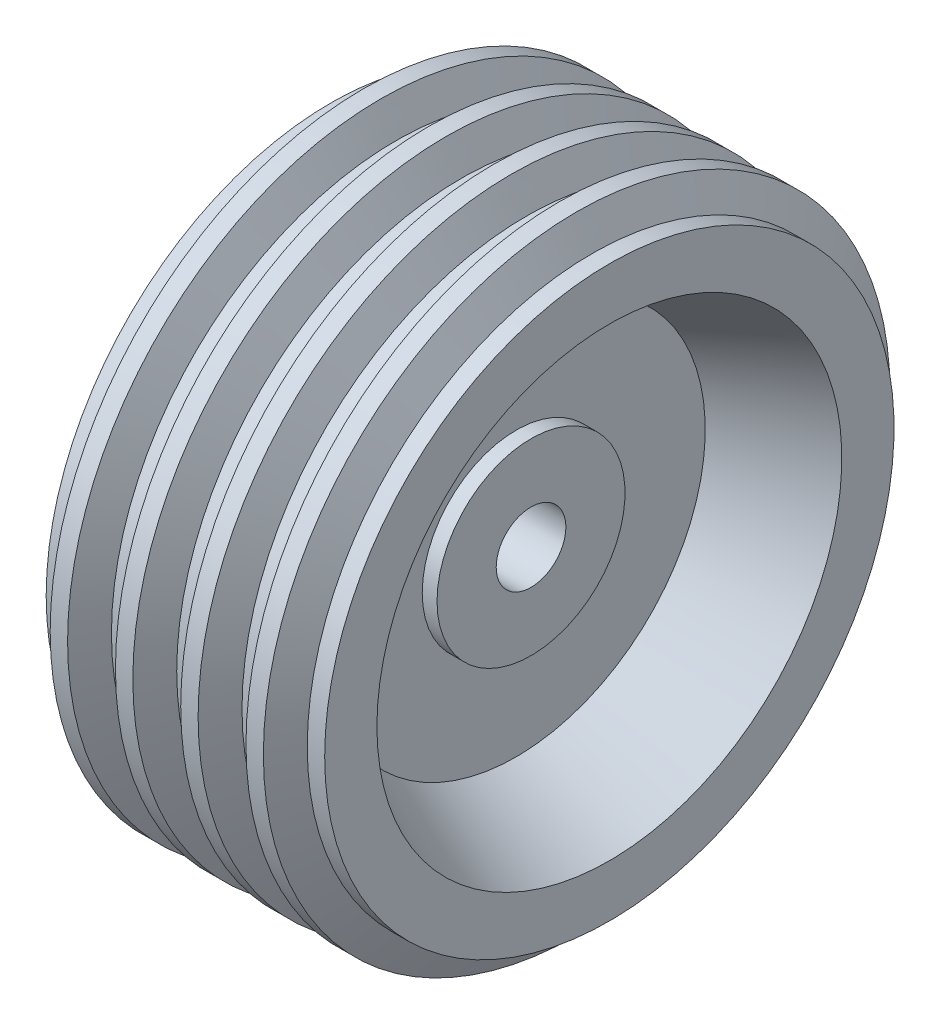
ISO-10303-21;
HEADER;
FILE_DESCRIPTION(('STEP AP214'),'2;1');
FILE_NAME('part.step','',(''),(''),'','','');
FILE_SCHEMA(('AUTOMOTIVE_DESIGN { 1 0 10303 214 1 1 1 1 }'));
ENDSEC;
DATA;
#1=APPLICATION_CONTEXT('core data for automotive mechanical design processes');
#2=APPLICATION_PROTOCOL_DEFINITION('international standard','automotive_design',2000,#1);
#3=PRODUCT_CONTEXT('',#1,'mechanical');
#4=PRODUCT('Part','Part','',(#3));
#5=PRODUCT_RELATED_PRODUCT_CATEGORY('part','',(#4));
#6=PRODUCT_DEFINITION_FORMATION('','',#4);
#7=PRODUCT_DEFINITION_CONTEXT('part definition',#1,'design');
#8=PRODUCT_DEFINITION('design','',#6,#7);
#9=PRODUCT_DEFINITION_SHAPE('','',#8);
#10=(LENGTH_UNIT() NAMED_UNIT(*) SI_UNIT(.MILLI.,.METRE.));
#11=(NAMED_UNIT(*) PLANE_ANGLE_UNIT() SI_UNIT($,.RADIAN.));
#12=(NAMED_UNIT(*) SI_UNIT($,.STERADIAN.) SOLID_ANGLE_UNIT());
#13=UNCERTAINTY_MEASURE_WITH_UNIT(LENGTH_MEASURE(1.E-05),#10,'distance_accuracy_value','');
#14=(GEOMETRIC_REPRESENTATION_CONTEXT(3) GLOBAL_UNCERTAINTY_ASSIGNED_CONTEXT((#13)) GLOBAL_UNIT_ASSIGNED_CONTEXT((#10,
#11,#12)) REPRESENTATION_CONTEXT('',''));
#15=CARTESIAN_POINT('',(0.,0.,0.));
#16=DIRECTION('',(0.,0.,1.));
#17=DIRECTION('',(1.,0.,0.));
#18=AXIS2_PLACEMENT_3D('',#15,#16,#17);
#19=CARTESIAN_POINT('',(-35.,0.,0.));
#20=DIRECTION('',(-1.,0.,0.));
#21=DIRECTION('',(0.,0.,1.));
#22=AXIS2_PLACEMENT_3D('',#19,#20,#21);
#23=PLANE('',#22);
#24=CARTESIAN_POINT('',(-35.,0.,0.));
#25=DIRECTION('',(-1.,0.,0.));
#26=DIRECTION('',(0.,0.,1.));
#27=AXIS2_PLACEMENT_3D('',#24,#25,#26);
#28=CIRCLE('',#27,54.);
#29=CARTESIAN_POINT('',(-35.,0.,54.));
#30=VERTEX_POINT('',#29);
#31=EDGE_CURVE('E121',#30,#30,#28,.T.);
#32=ORIENTED_EDGE('',*,*,#31,.T.);
#33=EDGE_LOOP('',(#32));
#34=FACE_BOUND('',#33,.T.);
#35=CARTESIAN_POINT('',(-35.,0.,0.));
#36=DIRECTION('',(-1.,0.,0.));
#37=DIRECTION('',(0.,0.,1.));
#38=AXIS2_PLACEMENT_3D('',#35,#36,#37);
#39=CIRCLE('',#38,20.);
#40=CARTESIAN_POINT('',(-35.,0.,20.));
#41=VERTEX_POINT('',#40);
#42=EDGE_CURVE('E10',#41,#41,#39,.T.);
#43=ORIENTED_EDGE('',*,*,#42,.F.);
#44=EDGE_LOOP('',(#43));
#45=FACE_BOUND('',#44,.T.);
#46=ADVANCED_FACE('F33',(#34,#45),#23,.T.);
#47=CARTESIAN_POINT('',(-35.,0.,0.));
#48=DIRECTION('',(-1.,0.,0.));
#49=DIRECTION('',(0.,0.,1.));
#50=AXIS2_PLACEMENT_3D('',#47,#48,#49);
#51=CYLINDRICAL_SURFACE('',#50,20.);
#52=CARTESIAN_POINT('',(35.,0.,0.));
#53=DIRECTION('',(-1.,0.,0.));
#54=DIRECTION('',(0.,0.,1.));
#55=AXIS2_PLACEMENT_3D('',#52,#53,#54);
#56=CIRCLE('',#55,20.);
#57=CARTESIAN_POINT('',(35.,0.,20.));
#58=VERTEX_POINT('',#57);
#59=EDGE_CURVE('E39',#58,#58,#56,.T.);
#60=ORIENTED_EDGE('',*,*,#59,.F.);
#61=EDGE_LOOP('',(#60));
#62=FACE_BOUND('',#61,.T.);
#63=ORIENTED_EDGE('',*,*,#42,.T.);
#64=EDGE_LOOP('',(#63));
#65=FACE_BOUND('',#64,.T.);
#66=ADVANCED_FACE('F139',(#62,#65),#51,.F.);
#67=CARTESIAN_POINT('',(35.,0.,0.));
#68=DIRECTION('',(-1.,0.,0.));
#69=DIRECTION('',(0.,0.,1.));
#70=AXIS2_PLACEMENT_3D('',#67,#68,#69);
#71=PLANE('',#70);
#72=CARTESIAN_POINT('',(35.,0.,0.));
#73=DIRECTION('',(-1.,0.,0.));
#74=DIRECTION('',(0.,0.,1.));
#75=AXIS2_PLACEMENT_3D('',#72,#73,#74);
#76=CIRCLE('',#75,54.);
#77=CARTESIAN_POINT('',(35.,0.,54.));
#78=VERTEX_POINT('',#77);
#79=EDGE_CURVE('E43',#78,#78,#76,.T.);
#80=ORIENTED_EDGE('',*,*,#79,.F.);
#81=EDGE_LOOP('',(#80));
#82=FACE_BOUND('',#81,.T.);
#83=ORIENTED_EDGE('',*,*,#59,.T.);
#84=EDGE_LOOP('',(#83));
#85=FACE_BOUND('',#84,.T.);
#86=ADVANCED_FACE('F143',(#82,#85),#71,.F.);
#87=CARTESIAN_POINT('',(-35.,0.,0.));
#88=DIRECTION('',(-1.,0.,0.));
#89=DIRECTION('',(0.,0.,1.));
#90=AXIS2_PLACEMENT_3D('',#87,#88,#89);
#91=CYLINDRICAL_SURFACE('',#90,54.);
#92=CARTESIAN_POINT('',(26.5,0.,0.));
#93=DIRECTION('',(-1.,0.,0.));
#94=DIRECTION('',(0.,0.,1.));
#95=AXIS2_PLACEMENT_3D('',#92,#93,#94);
#96=CIRCLE('',#95,54.);
#97=CARTESIAN_POINT('',(26.5,0.,54.));
#98=VERTEX_POINT('',#97);
#99=EDGE_CURVE('E47',#98,#98,#96,.T.);
#100=ORIENTED_EDGE('',*,*,#99,.F.);
#101=EDGE_LOOP('',(#100));
#102=FACE_BOUND('',#101,.T.);
#103=ORIENTED_EDGE('',*,*,#79,.T.);
#104=EDGE_LOOP('',(#103));
#105=FACE_BOUND('',#104,.T.);
#106=ADVANCED_FACE('F148',(#102,#105),#91,.T.);
#107=CARTESIAN_POINT('',(26.5,0.,0.));
#108=DIRECTION('',(-1.,0.,0.));
#109=DIRECTION('',(0.,0.,1.));
#110=AXIS2_PLACEMENT_3D('',#107,#108,#109);
#111=PLANE('',#110);
#112=CARTESIAN_POINT('',(26.5,0.,0.));
#113=DIRECTION('',(-1.,0.,0.));
#114=DIRECTION('',(0.,0.,1.));
#115=AXIS2_PLACEMENT_3D('',#112,#113,#114);
#116=CIRCLE('',#115,108.596183718707);
#117=CARTESIAN_POINT('',(26.5,0.,108.596183718707));
#118=VERTEX_POINT('',#117);
#119=EDGE_CURVE('E52',#118,#118,#116,.T.);
#120=ORIENTED_EDGE('',*,*,#119,.F.);
#121=EDGE_LOOP('',(#120));
#122=FACE_BOUND('',#121,.T.);
#123=ORIENTED_EDGE('',*,*,#99,.T.);
#124=EDGE_LOOP('',(#123));
#125=FACE_BOUND('',#124,.T.);
#126=ADVANCED_FACE('F154',(#122,#125),#111,.F.);
#127=CARTESIAN_POINT('',(80.,0.,0.));
#128=DIRECTION('',(1.,0.,0.));
#129=DIRECTION('',(0.,0.,-1.));
#130=AXIS2_PLACEMENT_3D('',#127,#128,#129);
#131=CONICAL_SURFACE('',#130,133.54364343,0.436332312998587);
#132=ORIENTED_EDGE('',*,*,#119,.T.);
#133=EDGE_LOOP('',(#132));
#134=FACE_BOUND('',#133,.T.);
#135=CARTESIAN_POINT('',(80.,0.,0.));
#136=DIRECTION('',(-1.,0.,0.));
#137=DIRECTION('',(0.,0.,1.));
#138=AXIS2_PLACEMENT_3D('',#135,#136,#137);
#139=CIRCLE('',#138,133.54364343);
#140=CARTESIAN_POINT('',(80.,0.,133.54364343));
#141=VERTEX_POINT('',#140);
#142=EDGE_CURVE('E55',#141,#141,#139,.T.);
#143=ORIENTED_EDGE('',*,*,#142,.F.);
#144=EDGE_LOOP('',(#143));
#145=FACE_BOUND('',#144,.T.);
#146=ADVANCED_FACE('F158',(#134,#145),#131,.F.);
#147=CARTESIAN_POINT('',(80.,0.,0.));
#148=DIRECTION('',(1.,0.,0.));
#149=DIRECTION('',(0.,0.,-1.));
#150=AXIS2_PLACEMENT_3D('',#147,#148,#149);
#151=PLANE('',#150);
#152=ORIENTED_EDGE('',*,*,#142,.T.);
#153=EDGE_LOOP('',(#152));
#154=FACE_BOUND('',#153,.T.);
#155=CARTESIAN_POINT('',(80.,0.,0.));
#156=DIRECTION('',(-1.,0.,0.));
#157=DIRECTION('',(0.,0.,1.));
#158=AXIS2_PLACEMENT_3D('',#155,#156,#157);
#159=CIRCLE('',#158,163.54364343);
#160=CARTESIAN_POINT('',(80.,0.,163.54364343));
#161=VERTEX_POINT('',#160);
#162=EDGE_CURVE('E58',#161,#161,#159,.T.);
#163=ORIENTED_EDGE('',*,*,#162,.F.);
#164=EDGE_LOOP('',(#163));
#165=FACE_BOUND('',#164,.T.);
#166=ADVANCED_FACE('F162',(#154,#165),#151,.T.);
#167=CARTESIAN_POINT('',(-35.,0.,0.));
#168=DIRECTION('',(-1.,0.,0.));
#169=DIRECTION('',(0.,0.,1.));
#170=AXIS2_PLACEMENT_3D('',#167,#168,#169);
#171=CYLINDRICAL_SURFACE('',#170,163.54364343);
#172=ORIENTED_EDGE('',*,*,#162,.T.);
#173=EDGE_LOOP('',(#172));
#174=FACE_BOUND('',#173,.T.);
#175=CARTESIAN_POINT('',(69.9916425424816,0.,0.));
#176=DIRECTION('',(-1.,0.,0.));
#177=DIRECTION('',(0.,0.,1.));
#178=AXIS2_PLACEMENT_3D('',#175,#176,#177);
#179=CIRCLE('',#178,163.54364343);
#180=CARTESIAN_POINT('',(69.9916425424816,0.,163.54364343));
#181=VERTEX_POINT('',#180);
#182=EDGE_CURVE('E61',#181,#181,#179,.T.);
#183=ORIENTED_EDGE('',*,*,#182,.F.);
#184=EDGE_LOOP('',(#183));
#185=FACE_BOUND('',#184,.T.);
#186=ADVANCED_FACE('F166',(#174,#185),#171,.T.);
#187=CARTESIAN_POINT('',(61.2416425434285,0.,0.));
#188=DIRECTION('',(-1.,0.,0.));
#189=DIRECTION('',(0.,0.,1.));
#190=AXIS2_PLACEMENT_3D('',#187,#188,#189);
#191=CONICAL_SURFACE('',#190,180.,1.0821041362365);
#192=ORIENTED_EDGE('',*,*,#182,.T.);
#193=EDGE_LOOP('',(#192));
#194=FACE_BOUND('',#193,.T.);
#195=CARTESIAN_POINT('',(61.2416425434285,0.,0.));
#196=DIRECTION('',(-1.,0.,0.));
#197=DIRECTION('',(0.,0.,1.));
#198=AXIS2_PLACEMENT_3D('',#195,#196,#197);
#199=CIRCLE('',#198,180.);
#200=CARTESIAN_POINT('',(61.2416425434285,0.,180.));
#201=VERTEX_POINT('',#200);
#202=EDGE_CURVE('E64',#201,#201,#199,.T.);
#203=ORIENTED_EDGE('',*,*,#202,.F.);
#204=EDGE_LOOP('',(#203));
#205=FACE_BOUND('',#204,.T.);
#206=ADVANCED_FACE('F170',(#194,#205),#191,.T.);
#207=CARTESIAN_POINT('',(-35.,0.,0.));
#208=DIRECTION('',(-1.,0.,0.));
#209=DIRECTION('',(0.,0.,1.));
#210=AXIS2_PLACEMENT_3D('',#207,#208,#209);
#211=CYLINDRICAL_SURFACE('',#210,180.);
#212=ORIENTED_EDGE('',*,*,#202,.T.);
#213=EDGE_LOOP('',(#212));
#214=FACE_BOUND('',#213,.T.);
#215=CARTESIAN_POINT('',(51.2416425415352,0.,0.));
#216=DIRECTION('',(-1.,0.,0.));
#217=DIRECTION('',(0.,0.,1.));
#218=AXIS2_PLACEMENT_3D('',#215,#216,#217);
#219=CIRCLE('',#218,180.);
#220=CARTESIAN_POINT('',(51.2416425415352,0.,180.));
#221=VERTEX_POINT('',#220);
#222=EDGE_CURVE('E67',#221,#221,#219,.T.);
#223=ORIENTED_EDGE('',*,*,#222,.F.);
#224=EDGE_LOOP('',(#223));
#225=FACE_BOUND('',#224,.T.);
#226=ADVANCED_FACE('F174',(#214,#225),#211,.T.);
#227=CARTESIAN_POINT('',(42.5000000028402,0.,0.));
#228=DIRECTION('',(1.,0.,0.));
#229=DIRECTION('',(0.,0.,-1.));
#230=AXIS2_PLACEMENT_3D('',#227,#228,#229);
#231=CONICAL_SURFACE('',#230,163.54364343,1.08250014236131);
#232=ORIENTED_EDGE('',*,*,#222,.T.);
#233=EDGE_LOOP('',(#232));
#234=FACE_BOUND('',#233,.T.);
#235=CARTESIAN_POINT('',(42.5000000028402,0.,0.));
#236=DIRECTION('',(-1.,0.,0.));
#237=DIRECTION('',(0.,0.,1.));
#238=AXIS2_PLACEMENT_3D('',#235,#236,#237);
#239=CIRCLE('',#238,163.54364343);
#240=CARTESIAN_POINT('',(42.5000000028402,0.,163.54364343));
#241=VERTEX_POINT('',#240);
#242=EDGE_CURVE('E70',#241,#241,#239,.T.);
#243=ORIENTED_EDGE('',*,*,#242,.F.);
#244=EDGE_LOOP('',(#243));
#245=FACE_BOUND('',#244,.T.);
#246=ADVANCED_FACE('F178',(#234,#245),#231,.T.);
#247=CARTESIAN_POINT('',(-35.,0.,0.));
#248=DIRECTION('',(-1.,0.,0.));
#249=DIRECTION('',(0.,0.,1.));
#250=AXIS2_PLACEMENT_3D('',#247,#248,#249);
#251=CYLINDRICAL_SURFACE('',#250,163.54364343);
#252=ORIENTED_EDGE('',*,*,#242,.T.);
#253=EDGE_LOOP('',(#252));
#254=FACE_BOUND('',#253,.T.);
#255=CARTESIAN_POINT('',(32.5000000009469,0.,0.));
#256=DIRECTION('',(-1.,0.,0.));
#257=DIRECTION('',(0.,0.,1.));
#258=AXIS2_PLACEMENT_3D('',#255,#256,#257);
#259=CIRCLE('',#258,163.54364343);
#260=CARTESIAN_POINT('',(32.5000000009469,0.,163.54364343));
#261=VERTEX_POINT('',#260);
#262=EDGE_CURVE('E73',#261,#261,#259,.T.);
#263=ORIENTED_EDGE('',*,*,#262,.F.);
#264=EDGE_LOOP('',(#263));
#265=FACE_BOUND('',#264,.T.);
#266=ADVANCED_FACE('F182',(#254,#265),#251,.T.);
#267=CARTESIAN_POINT('',(23.7500000018934,0.,0.));
#268=DIRECTION('',(-1.,0.,0.));
#269=DIRECTION('',(0.,0.,1.));
#270=AXIS2_PLACEMENT_3D('',#267,#268,#269);
#271=CONICAL_SURFACE('',#270,180.,1.08210413623647);
#272=ORIENTED_EDGE('',*,*,#262,.T.);
#273=EDGE_LOOP('',(#272));
#274=FACE_BOUND('',#273,.T.);
#275=CARTESIAN_POINT('',(23.7500000018934,0.,0.));
#276=DIRECTION('',(-1.,0.,0.));
#277=DIRECTION('',(0.,0.,1.));
#278=AXIS2_PLACEMENT_3D('',#275,#276,#277);
#279=CIRCLE('',#278,180.);
#280=CARTESIAN_POINT('',(23.7500000018934,0.,180.));
#281=VERTEX_POINT('',#280);
#282=EDGE_CURVE('E76',#281,#281,#279,.T.);
#283=ORIENTED_EDGE('',*,*,#282,.F.);
#284=EDGE_LOOP('',(#283));
#285=FACE_BOUND('',#284,.T.);
#286=ADVANCED_FACE('F186',(#274,#285),#271,.T.);
#287=CARTESIAN_POINT('',(-35.,0.,0.));
#288=DIRECTION('',(-1.,0.,0.));
#289=DIRECTION('',(0.,0.,1.));
#290=AXIS2_PLACEMENT_3D('',#287,#288,#289);
#291=CYLINDRICAL_SURFACE('',#290,180.);
#292=ORIENTED_EDGE('',*,*,#282,.T.);
#293=EDGE_LOOP('',(#292));
#294=FACE_BOUND('',#293,.T.);
#295=CARTESIAN_POINT('',(13.75,0.,0.));
#296=DIRECTION('',(-1.,0.,0.));
#297=DIRECTION('',(0.,0.,1.));
#298=AXIS2_PLACEMENT_3D('',#295,#296,#297);
#299=CIRCLE('',#298,180.);
#300=CARTESIAN_POINT('',(13.75,0.,180.));
#301=VERTEX_POINT('',#300);
#302=EDGE_CURVE('E79',#301,#301,#299,.T.);
#303=ORIENTED_EDGE('',*,*,#302,.F.);
#304=EDGE_LOOP('',(#303));
#305=FACE_BOUND('',#304,.T.);
#306=ADVANCED_FACE('F190',(#294,#305),#291,.T.);
#307=CARTESIAN_POINT('',(13.75,0.,0.));
#308=DIRECTION('',(1.,0.,0.));
#309=DIRECTION('',(0.,0.,-1.));
#310=AXIS2_PLACEMENT_3D('',#307,#308,#309);
#311=CONICAL_SURFACE('',#310,180.,1.08210413623648);
#312=CARTESIAN_POINT('',(5.00000000094658,0.,0.));
#313=DIRECTION('',(-1.,0.,0.));
#314=DIRECTION('',(0.,0.,1.));
#315=AXIS2_PLACEMENT_3D('',#312,#313,#314);
#316=CIRCLE('',#315,163.54364343);
#317=CARTESIAN_POINT('',(5.00000000094658,0.,163.54364343));
#318=VERTEX_POINT('',#317);
#319=EDGE_CURVE('E82',#318,#318,#316,.T.);
#320=ORIENTED_EDGE('',*,*,#319,.F.);
#321=EDGE_LOOP('',(#320));
#322=FACE_BOUND('',#321,.T.);
#323=ORIENTED_EDGE('',*,*,#302,.T.);
#324=EDGE_LOOP('',(#323));
#325=FACE_BOUND('',#324,.T.);
#326=ADVANCED_FACE('F194',(#322,#325),#311,.T.);
#327=CARTESIAN_POINT('',(-35.,0.,0.));
#328=DIRECTION('',(-1.,0.,0.));
#329=DIRECTION('',(0.,0.,1.));
#330=AXIS2_PLACEMENT_3D('',#327,#328,#329);
#331=CYLINDRICAL_SURFACE('',#330,163.54364343);
#332=CARTESIAN_POINT('',(-5.0000000009467,0.,0.));
#333=DIRECTION('',(-1.,0.,0.));
#334=DIRECTION('',(0.,0.,1.));
#335=AXIS2_PLACEMENT_3D('',#332,#333,#334);
#336=CIRCLE('',#335,163.54364343);
#337=CARTESIAN_POINT('',(-5.0000000009467,0.,163.54364343));
#338=VERTEX_POINT('',#337);
#339=EDGE_CURVE('E85',#338,#338,#336,.T.);
#340=ORIENTED_EDGE('',*,*,#339,.F.);
#341=EDGE_LOOP('',(#340));
#342=FACE_BOUND('',#341,.T.);
#343=ORIENTED_EDGE('',*,*,#319,.T.);
#344=EDGE_LOOP('',(#343));
#345=FACE_BOUND('',#344,.T.);
#346=ADVANCED_FACE('F198',(#342,#345),#331,.T.);
#347=CARTESIAN_POINT('',(-13.75,0.,0.));
#348=DIRECTION('',(-1.,0.,0.));
#349=DIRECTION('',(0.,0.,1.));
#350=AXIS2_PLACEMENT_3D('',#347,#348,#349);
#351=CONICAL_SURFACE('',#350,180.,1.08210413623649);
#352=ORIENTED_EDGE('',*,*,#339,.T.);
#353=EDGE_LOOP('',(#352));
#354=FACE_BOUND('',#353,.T.);
#355=CARTESIAN_POINT('',(-13.75,0.,0.));
#356=DIRECTION('',(-1.,0.,0.));
#357=DIRECTION('',(0.,0.,1.));
#358=AXIS2_PLACEMENT_3D('',#355,#356,#357);
#359=CIRCLE('',#358,180.);
#360=CARTESIAN_POINT('',(-13.75,0.,180.));
#361=VERTEX_POINT('',#360);
#362=EDGE_CURVE('E88',#361,#361,#359,.T.);
#363=ORIENTED_EDGE('',*,*,#362,.F.);
#364=EDGE_LOOP('',(#363));
#365=FACE_BOUND('',#364,.T.);
#366=ADVANCED_FACE('F202',(#354,#365),#351,.T.);
#367=CARTESIAN_POINT('',(-35.,0.,0.));
#368=DIRECTION('',(-1.,0.,0.));
#369=DIRECTION('',(0.,0.,1.));
#370=AXIS2_PLACEMENT_3D('',#367,#368,#369);
#371=CYLINDRICAL_SURFACE('',#370,180.);
#372=CARTESIAN_POINT('',(-23.7500000018934,0.,0.));
#373=DIRECTION('',(-1.,0.,0.));
#374=DIRECTION('',(0.,0.,1.));
#375=AXIS2_PLACEMENT_3D('',#372,#373,#374);
#376=CIRCLE('',#375,180.);
#377=CARTESIAN_POINT('',(-23.7500000018934,0.,180.));
#378=VERTEX_POINT('',#377);
#379=EDGE_CURVE('E91',#378,#378,#376,.T.);
#380=ORIENTED_EDGE('',*,*,#379,.F.);
#381=EDGE_LOOP('',(#380));
#382=FACE_BOUND('',#381,.T.);
#383=ORIENTED_EDGE('',*,*,#362,.T.);
#384=EDGE_LOOP('',(#383));
#385=FACE_BOUND('',#384,.T.);
#386=ADVANCED_FACE('F206',(#382,#385),#371,.T.);
#387=CARTESIAN_POINT('',(-23.7500000018934,0.,0.));
#388=DIRECTION('',(1.,0.,0.));
#389=DIRECTION('',(0.,0.,-1.));
#390=AXIS2_PLACEMENT_3D('',#387,#388,#389);
#391=CONICAL_SURFACE('',#390,180.,1.0821041362365);
#392=CARTESIAN_POINT('',(-32.5000000009465,0.,0.));
#393=DIRECTION('',(-1.,0.,0.));
#394=DIRECTION('',(0.,0.,1.));
#395=AXIS2_PLACEMENT_3D('',#392,#393,#394);
#396=CIRCLE('',#395,163.54364343);
#397=CARTESIAN_POINT('',(-32.5000000009465,0.,163.54364343));
#398=VERTEX_POINT('',#397);
#399=EDGE_CURVE('E94',#398,#398,#396,.T.);
#400=ORIENTED_EDGE('',*,*,#399,.F.);
#401=EDGE_LOOP('',(#400));
#402=FACE_BOUND('',#401,.T.);
#403=ORIENTED_EDGE('',*,*,#379,.T.);
#404=EDGE_LOOP('',(#403));
#405=FACE_BOUND('',#404,.T.);
#406=ADVANCED_FACE('F210',(#402,#405),#391,.T.);
#407=CARTESIAN_POINT('',(-35.,0.,0.));
#408=DIRECTION('',(-1.,0.,0.));
#409=DIRECTION('',(0.,0.,1.));
#410=AXIS2_PLACEMENT_3D('',#407,#408,#409);
#411=CYLINDRICAL_SURFACE('',#410,163.54364343);
#412=CARTESIAN_POINT('',(-42.5000000028396,0.,0.));
#413=DIRECTION('',(-1.,0.,0.));
#414=DIRECTION('',(0.,0.,1.));
#415=AXIS2_PLACEMENT_3D('',#412,#413,#414);
#416=CIRCLE('',#415,163.54364343);
#417=CARTESIAN_POINT('',(-42.5000000028396,0.,163.54364343));
#418=VERTEX_POINT('',#417);
#419=EDGE_CURVE('E97',#418,#418,#416,.T.);
#420=ORIENTED_EDGE('',*,*,#419,.F.);
#421=EDGE_LOOP('',(#420));
#422=FACE_BOUND('',#421,.T.);
#423=ORIENTED_EDGE('',*,*,#399,.T.);
#424=EDGE_LOOP('',(#423));
#425=FACE_BOUND('',#424,.T.);
#426=ADVANCED_FACE('F214',(#422,#425),#411,.T.);
#427=CARTESIAN_POINT('',(-42.5000000028396,0.,0.));
#428=DIRECTION('',(-1.,0.,0.));
#429=DIRECTION('',(0.,0.,1.));
#430=AXIS2_PLACEMENT_3D('',#427,#428,#429);
#431=CONICAL_SURFACE('',#430,163.54364343,1.08250014236128);
#432=CARTESIAN_POINT('',(-51.2416425415351,0.,0.));
#433=DIRECTION('',(-1.,0.,0.));
#434=DIRECTION('',(0.,0.,1.));
#435=AXIS2_PLACEMENT_3D('',#432,#433,#434);
#436=CIRCLE('',#435,180.);
#437=CARTESIAN_POINT('',(-51.2416425415351,0.,180.));
#438=VERTEX_POINT('',#437);
#439=EDGE_CURVE('E100',#438,#438,#436,.T.);
#440=ORIENTED_EDGE('',*,*,#439,.F.);
#441=EDGE_LOOP('',(#440));
#442=FACE_BOUND('',#441,.T.);
#443=ORIENTED_EDGE('',*,*,#419,.T.);
#444=EDGE_LOOP('',(#443));
#445=FACE_BOUND('',#444,.T.);
#446=ADVANCED_FACE('F218',(#442,#445),#431,.T.);
#447=CARTESIAN_POINT('',(-35.,0.,0.));
#448=DIRECTION('',(-1.,0.,0.));
#449=DIRECTION('',(0.,0.,1.));
#450=AXIS2_PLACEMENT_3D('',#447,#448,#449);
#451=CYLINDRICAL_SURFACE('',#450,180.);
#452=CARTESIAN_POINT('',(-61.2416425434282,0.,0.));
#453=DIRECTION('',(-1.,0.,0.));
#454=DIRECTION('',(0.,0.,1.));
#455=AXIS2_PLACEMENT_3D('',#452,#453,#454);
#456=CIRCLE('',#455,180.);
#457=CARTESIAN_POINT('',(-61.2416425434282,0.,180.));
#458=VERTEX_POINT('',#457);
#459=EDGE_CURVE('E103',#458,#458,#456,.T.);
#460=ORIENTED_EDGE('',*,*,#459,.F.);
#461=EDGE_LOOP('',(#460));
#462=FACE_BOUND('',#461,.T.);
#463=ORIENTED_EDGE('',*,*,#439,.T.);
#464=EDGE_LOOP('',(#463));
#465=FACE_BOUND('',#464,.T.);
#466=ADVANCED_FACE('F222',(#462,#465),#451,.T.);
#467=CARTESIAN_POINT('',(-61.2416425434282,0.,0.));
#468=DIRECTION('',(1.,0.,0.));
#469=DIRECTION('',(0.,0.,-1.));
#470=AXIS2_PLACEMENT_3D('',#467,#468,#469);
#471=CONICAL_SURFACE('',#470,180.,1.08210413623648);
#472=CARTESIAN_POINT('',(-69.9916425424816,0.,0.));
#473=DIRECTION('',(-1.,0.,0.));
#474=DIRECTION('',(0.,0.,1.));
#475=AXIS2_PLACEMENT_3D('',#472,#473,#474);
#476=CIRCLE('',#475,163.54364343);
#477=CARTESIAN_POINT('',(-69.9916425424816,0.,163.54364343));
#478=VERTEX_POINT('',#477);
#479=EDGE_CURVE('E106',#478,#478,#476,.T.);
#480=ORIENTED_EDGE('',*,*,#479,.F.);
#481=EDGE_LOOP('',(#480));
#482=FACE_BOUND('',#481,.T.);
#483=ORIENTED_EDGE('',*,*,#459,.T.);
#484=EDGE_LOOP('',(#483));
#485=FACE_BOUND('',#484,.T.);
#486=ADVANCED_FACE('F226',(#482,#485),#471,.T.);
#487=CARTESIAN_POINT('',(-35.,0.,0.));
#488=DIRECTION('',(-1.,0.,0.));
#489=DIRECTION('',(0.,0.,1.));
#490=AXIS2_PLACEMENT_3D('',#487,#488,#489);
#491=CYLINDRICAL_SURFACE('',#490,163.54364343);
#492=CARTESIAN_POINT('',(-80.,0.,0.));
#493=DIRECTION('',(-1.,0.,0.));
#494=DIRECTION('',(0.,0.,1.));
#495=AXIS2_PLACEMENT_3D('',#492,#493,#494);
#496=CIRCLE('',#495,163.54364343);
#497=CARTESIAN_POINT('',(-80.,0.,163.54364343));
#498=VERTEX_POINT('',#497);
#499=EDGE_CURVE('E109',#498,#498,#496,.T.);
#500=ORIENTED_EDGE('',*,*,#499,.F.);
#501=EDGE_LOOP('',(#500));
#502=FACE_BOUND('',#501,.T.);
#503=ORIENTED_EDGE('',*,*,#479,.T.);
#504=EDGE_LOOP('',(#503));
#505=FACE_BOUND('',#504,.T.);
#506=ADVANCED_FACE('F230',(#502,#505),#491,.T.);
#507=CARTESIAN_POINT('',(-80.,0.,0.));
#508=DIRECTION('',(1.,0.,0.));
#509=DIRECTION('',(0.,0.,-1.));
#510=AXIS2_PLACEMENT_3D('',#507,#508,#509);
#511=PLANE('',#510);
#512=CARTESIAN_POINT('',(-80.,0.,0.));
#513=DIRECTION('',(-1.,0.,0.));
#514=DIRECTION('',(0.,0.,1.));
#515=AXIS2_PLACEMENT_3D('',#512,#513,#514);
#516=CIRCLE('',#515,133.54364343);
#517=CARTESIAN_POINT('',(-80.,0.,133.54364343));
#518=VERTEX_POINT('',#517);
#519=EDGE_CURVE('E112',#518,#518,#516,.T.);
#520=ORIENTED_EDGE('',*,*,#519,.F.);
#521=EDGE_LOOP('',(#520));
#522=FACE_BOUND('',#521,.T.);
#523=ORIENTED_EDGE('',*,*,#499,.T.);
#524=EDGE_LOOP('',(#523));
#525=FACE_BOUND('',#524,.T.);
#526=ADVANCED_FACE('F234',(#522,#525),#511,.F.);
#527=CARTESIAN_POINT('',(-80.,0.,0.));
#528=DIRECTION('',(-1.,0.,0.));
#529=DIRECTION('',(0.,0.,1.));
#530=AXIS2_PLACEMENT_3D('',#527,#528,#529);
#531=CONICAL_SURFACE('',#530,133.54364343,0.436332312998587);
#532=CARTESIAN_POINT('',(-26.5,0.,0.));
#533=DIRECTION('',(-1.,0.,0.));
#534=DIRECTION('',(0.,0.,1.));
#535=AXIS2_PLACEMENT_3D('',#532,#533,#534);
#536=CIRCLE('',#535,108.596183718707);
#537=CARTESIAN_POINT('',(-26.5,0.,108.596183718707));
#538=VERTEX_POINT('',#537);
#539=EDGE_CURVE('E115',#538,#538,#536,.T.);
#540=ORIENTED_EDGE('',*,*,#539,.F.);
#541=EDGE_LOOP('',(#540));
#542=FACE_BOUND('',#541,.T.);
#543=ORIENTED_EDGE('',*,*,#519,.T.);
#544=EDGE_LOOP('',(#543));
#545=FACE_BOUND('',#544,.T.);
#546=ADVANCED_FACE('F135',(#542,#545),#531,.F.);
#547=CARTESIAN_POINT('',(-26.5,0.,0.));
#548=DIRECTION('',(-1.,0.,0.));
#549=DIRECTION('',(0.,0.,1.));
#550=AXIS2_PLACEMENT_3D('',#547,#548,#549);
#551=PLANE('',#550);
#552=ORIENTED_EDGE('',*,*,#539,.T.);
#553=EDGE_LOOP('',(#552));
#554=FACE_BOUND('',#553,.T.);
#555=CARTESIAN_POINT('',(-26.5,0.,0.));
#556=DIRECTION('',(-1.,0.,0.));
#557=DIRECTION('',(0.,0.,1.));
#558=AXIS2_PLACEMENT_3D('',#555,#556,#557);
#559=CIRCLE('',#558,54.);
#560=CARTESIAN_POINT('',(-26.5,0.,54.));
#561=VERTEX_POINT('',#560);
#562=EDGE_CURVE('E118',#561,#561,#559,.T.);
#563=ORIENTED_EDGE('',*,*,#562,.F.);
#564=EDGE_LOOP('',(#563));
#565=FACE_BOUND('',#564,.T.);
#566=ADVANCED_FACE('F129',(#554,#565),#551,.T.);
#567=CARTESIAN_POINT('',(-35.,0.,0.));
#568=DIRECTION('',(-1.,0.,0.));
#569=DIRECTION('',(0.,0.,1.));
#570=AXIS2_PLACEMENT_3D('',#567,#568,#569);
#571=CYLINDRICAL_SURFACE('',#570,54.);
#572=ORIENTED_EDGE('',*,*,#562,.T.);
#573=EDGE_LOOP('',(#572));
#574=FACE_BOUND('',#573,.T.);
#575=ORIENTED_EDGE('',*,*,#31,.F.);
#576=EDGE_LOOP('',(#575));
#577=FACE_BOUND('',#576,.T.);
#578=ADVANCED_FACE('F127',(#574,#577),#571,.T.);
#579=CLOSED_SHELL('',(#46,#66,#86,#106,#126,#146,#166,#186,#206,#226,#246,#266,#286,#306,#326,
#346,#366,#386,#406,#426,#446,#466,#486,#506,#526,#546,#566,#578));
#580=MANIFOLD_SOLID_BREP('B2',#579);
#581=ADVANCED_BREP_SHAPE_REPRESENTATION('',(#18,#580),#14);
#582=SHAPE_DEFINITION_REPRESENTATION(#9,#581);
ENDSEC;
END-ISO-10303-21;
